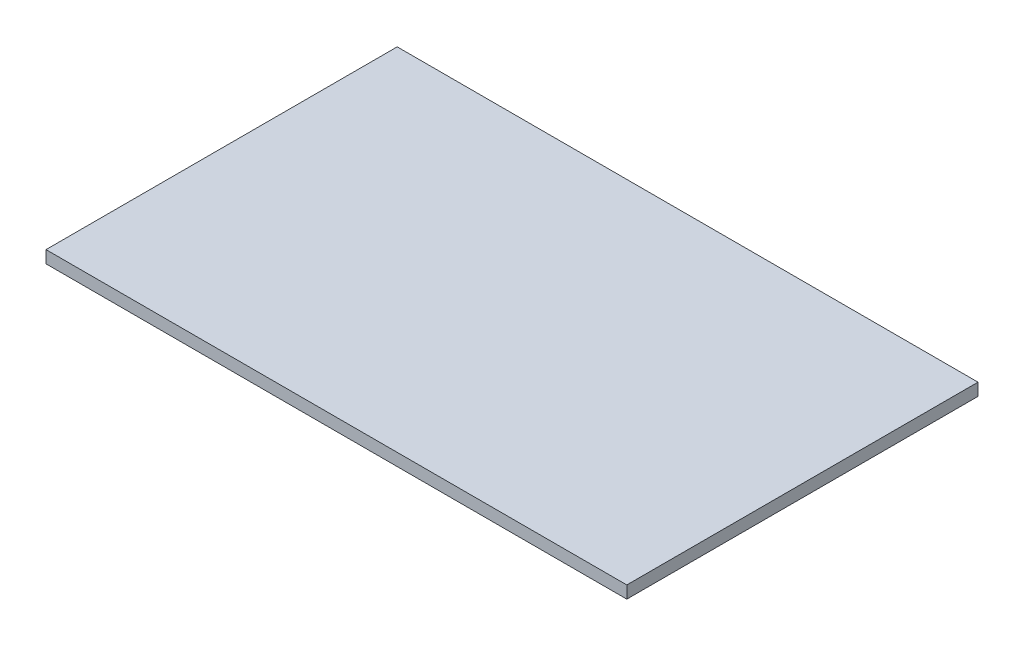
ISO-10303-21;
HEADER;
FILE_DESCRIPTION(('STEP AP214'),'2;1');
FILE_NAME('part.step','',(''),(''),'','','');
FILE_SCHEMA(('AUTOMOTIVE_DESIGN { 1 0 10303 214 1 1 1 1 }'));
ENDSEC;
DATA;
#1=APPLICATION_CONTEXT('core data for automotive mechanical design processes');
#2=APPLICATION_PROTOCOL_DEFINITION('international standard','automotive_design',2000,#1);
#3=PRODUCT_CONTEXT('',#1,'mechanical');
#4=PRODUCT('Part','Part','',(#3));
#5=PRODUCT_RELATED_PRODUCT_CATEGORY('part','',(#4));
#6=PRODUCT_DEFINITION_FORMATION('','',#4);
#7=PRODUCT_DEFINITION_CONTEXT('part definition',#1,'design');
#8=PRODUCT_DEFINITION('design','',#6,#7);
#9=PRODUCT_DEFINITION_SHAPE('','',#8);
#10=(LENGTH_UNIT() NAMED_UNIT(*) SI_UNIT(.MILLI.,.METRE.));
#11=(NAMED_UNIT(*) PLANE_ANGLE_UNIT() SI_UNIT($,.RADIAN.));
#12=(NAMED_UNIT(*) SI_UNIT($,.STERADIAN.) SOLID_ANGLE_UNIT());
#13=UNCERTAINTY_MEASURE_WITH_UNIT(LENGTH_MEASURE(1.E-05),#10,'distance_accuracy_value','');
#14=(GEOMETRIC_REPRESENTATION_CONTEXT(3) GLOBAL_UNCERTAINTY_ASSIGNED_CONTEXT((#13)) GLOBAL_UNIT_ASSIGNED_CONTEXT((#10,
#11,#12)) REPRESENTATION_CONTEXT('',''));
#15=CARTESIAN_POINT('',(0.,0.,0.));
#16=DIRECTION('',(0.,0.,1.));
#17=DIRECTION('',(1.,0.,0.));
#18=AXIS2_PLACEMENT_3D('',#15,#16,#17);
#19=CARTESIAN_POINT('',(0.,1.27,0.));
#20=DIRECTION('',(1.,0.,0.));
#21=DIRECTION('',(0.,0.,-1.));
#22=AXIS2_PLACEMENT_3D('',#19,#20,#21);
#23=PLANE('',#22);
#24=DIRECTION('',(0.,0.,1.));
#25=VECTOR('',#24,1.);
#26=CARTESIAN_POINT('',(0.,0.,0.));
#27=LINE('',#26,#25);
#28=CARTESIAN_POINT('',(0.,0.,-36.1696));
#29=VERTEX_POINT('',#28);
#30=CARTESIAN_POINT('',(0.,0.,0.));
#31=VERTEX_POINT('',#30);
#32=EDGE_CURVE('E99',#29,#31,#27,.T.);
#33=ORIENTED_EDGE('',*,*,#32,.T.);
#34=DIRECTION('',(0.,-1.,0.));
#35=VECTOR('',#34,1.);
#36=CARTESIAN_POINT('',(0.,1.27,0.));
#37=LINE('',#36,#35);
#38=CARTESIAN_POINT('',(0.,1.27,0.));
#39=VERTEX_POINT('',#38);
#40=EDGE_CURVE('E11',#39,#31,#37,.T.);
#41=ORIENTED_EDGE('',*,*,#40,.F.);
#42=DIRECTION('',(0.,0.,1.));
#43=VECTOR('',#42,1.);
#44=CARTESIAN_POINT('',(0.,1.27,0.));
#45=LINE('',#44,#43);
#46=CARTESIAN_POINT('',(0.,1.27,-36.1696));
#47=VERTEX_POINT('',#46);
#48=EDGE_CURVE('E87',#47,#39,#45,.T.);
#49=ORIENTED_EDGE('',*,*,#48,.F.);
#50=DIRECTION('',(0.,-1.,0.));
#51=VECTOR('',#50,1.);
#52=CARTESIAN_POINT('',(0.,1.27,-36.1696));
#53=LINE('',#52,#51);
#54=EDGE_CURVE('E95',#47,#29,#53,.T.);
#55=ORIENTED_EDGE('',*,*,#54,.T.);
#56=EDGE_LOOP('',(#33,#41,#49,#55));
#57=FACE_BOUND('',#56,.T.);
#58=ADVANCED_FACE('F36',(#57),#23,.F.);
#59=CARTESIAN_POINT('',(0.,1.27,0.));
#60=DIRECTION('',(0.,0.,-1.));
#61=DIRECTION('',(-1.,0.,0.));
#62=AXIS2_PLACEMENT_3D('',#59,#60,#61);
#63=PLANE('',#62);
#64=DIRECTION('',(1.,0.,0.));
#65=VECTOR('',#64,1.);
#66=CARTESIAN_POINT('',(0.,0.,0.));
#67=LINE('',#66,#65);
#68=CARTESIAN_POINT('',(59.817,0.,0.));
#69=VERTEX_POINT('',#68);
#70=EDGE_CURVE('E91',#31,#69,#67,.T.);
#71=ORIENTED_EDGE('',*,*,#70,.T.);
#72=DIRECTION('',(0.,-1.,0.));
#73=VECTOR('',#72,1.);
#74=CARTESIAN_POINT('',(59.817,1.27,0.));
#75=LINE('',#74,#73);
#76=CARTESIAN_POINT('',(59.817,1.27,0.));
#77=VERTEX_POINT('',#76);
#78=EDGE_CURVE('E44',#77,#69,#75,.T.);
#79=ORIENTED_EDGE('',*,*,#78,.F.);
#80=DIRECTION('',(1.,0.,0.));
#81=VECTOR('',#80,1.);
#82=CARTESIAN_POINT('',(0.,1.27,0.));
#83=LINE('',#82,#81);
#84=EDGE_CURVE('E82',#39,#77,#83,.T.);
#85=ORIENTED_EDGE('',*,*,#84,.F.);
#86=ORIENTED_EDGE('',*,*,#40,.T.);
#87=EDGE_LOOP('',(#71,#79,#85,#86));
#88=FACE_BOUND('',#87,.T.);
#89=ADVANCED_FACE('F90',(#88),#63,.F.);
#90=CARTESIAN_POINT('',(59.817,1.27,0.));
#91=DIRECTION('',(-1.,0.,0.));
#92=DIRECTION('',(0.,0.,1.));
#93=AXIS2_PLACEMENT_3D('',#90,#91,#92);
#94=PLANE('',#93);
#95=DIRECTION('',(0.,0.,-1.));
#96=VECTOR('',#95,1.);
#97=CARTESIAN_POINT('',(59.817,0.,0.));
#98=LINE('',#97,#96);
#99=CARTESIAN_POINT('',(59.817,0.,-36.1696));
#100=VERTEX_POINT('',#99);
#101=EDGE_CURVE('E69',#69,#100,#98,.T.);
#102=ORIENTED_EDGE('',*,*,#101,.T.);
#103=DIRECTION('',(0.,-1.,0.));
#104=VECTOR('',#103,1.);
#105=CARTESIAN_POINT('',(59.817,1.27,-36.1696));
#106=LINE('',#105,#104);
#107=CARTESIAN_POINT('',(59.817,1.27,-36.1696));
#108=VERTEX_POINT('',#107);
#109=EDGE_CURVE('E92',#108,#100,#106,.T.);
#110=ORIENTED_EDGE('',*,*,#109,.F.);
#111=DIRECTION('',(0.,0.,-1.));
#112=VECTOR('',#111,1.);
#113=CARTESIAN_POINT('',(59.817,1.27,0.));
#114=LINE('',#113,#112);
#115=EDGE_CURVE('E85',#77,#108,#114,.T.);
#116=ORIENTED_EDGE('',*,*,#115,.F.);
#117=ORIENTED_EDGE('',*,*,#78,.T.);
#118=EDGE_LOOP('',(#102,#110,#116,#117));
#119=FACE_BOUND('',#118,.T.);
#120=ADVANCED_FACE('F93',(#119),#94,.F.);
#121=CARTESIAN_POINT('',(0.,1.27,-36.1696));
#122=DIRECTION('',(0.,0.,1.));
#123=DIRECTION('',(1.,0.,0.));
#124=AXIS2_PLACEMENT_3D('',#121,#122,#123);
#125=PLANE('',#124);
#126=DIRECTION('',(-1.,0.,0.));
#127=VECTOR('',#126,1.);
#128=CARTESIAN_POINT('',(0.,0.,-36.1696));
#129=LINE('',#128,#127);
#130=EDGE_CURVE('E75',#100,#29,#129,.T.);
#131=ORIENTED_EDGE('',*,*,#130,.T.);
#132=ORIENTED_EDGE('',*,*,#54,.F.);
#133=DIRECTION('',(-1.,0.,0.));
#134=VECTOR('',#133,1.);
#135=CARTESIAN_POINT('',(0.,1.27,-36.1696));
#136=LINE('',#135,#134);
#137=EDGE_CURVE('E52',#108,#47,#136,.T.);
#138=ORIENTED_EDGE('',*,*,#137,.F.);
#139=ORIENTED_EDGE('',*,*,#109,.T.);
#140=EDGE_LOOP('',(#131,#132,#138,#139));
#141=FACE_BOUND('',#140,.T.);
#142=ADVANCED_FACE('F106',(#141),#125,.F.);
#143=CARTESIAN_POINT('',(0.,1.27,0.));
#144=DIRECTION('',(0.,-1.,0.));
#145=DIRECTION('',(0.,0.,-1.));
#146=AXIS2_PLACEMENT_3D('',#143,#144,#145);
#147=PLANE('',#146);
#148=ORIENTED_EDGE('',*,*,#48,.T.);
#149=ORIENTED_EDGE('',*,*,#84,.T.);
#150=ORIENTED_EDGE('',*,*,#115,.T.);
#151=ORIENTED_EDGE('',*,*,#137,.T.);
#152=EDGE_LOOP('',(#148,#149,#150,#151));
#153=FACE_BOUND('',#152,.T.);
#154=ADVANCED_FACE('F83',(#153),#147,.F.);
#155=CARTESIAN_POINT('',(0.,0.,0.));
#156=DIRECTION('',(0.,-1.,0.));
#157=DIRECTION('',(0.,0.,-1.));
#158=AXIS2_PLACEMENT_3D('',#155,#156,#157);
#159=PLANE('',#158);
#160=ORIENTED_EDGE('',*,*,#32,.F.);
#161=ORIENTED_EDGE('',*,*,#130,.F.);
#162=ORIENTED_EDGE('',*,*,#101,.F.);
#163=ORIENTED_EDGE('',*,*,#70,.F.);
#164=EDGE_LOOP('',(#160,#161,#162,#163));
#165=FACE_BOUND('',#164,.T.);
#166=ADVANCED_FACE('F109',(#165),#159,.T.);
#167=CLOSED_SHELL('',(#58,#89,#120,#142,#154,#166));
#168=MANIFOLD_SOLID_BREP('B2',#167);
#169=ADVANCED_BREP_SHAPE_REPRESENTATION('',(#18,#168),#14);
#170=SHAPE_DEFINITION_REPRESENTATION(#9,#169);
ENDSEC;
END-ISO-10303-21;
